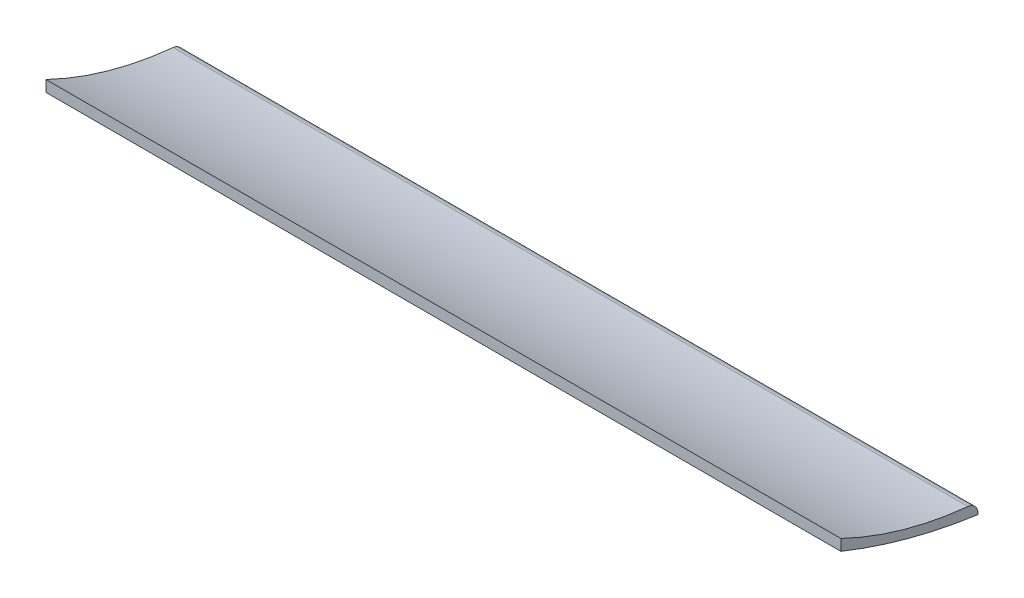
ISO-10303-21;
HEADER;
FILE_DESCRIPTION(('STEP AP214'),'2;1');
FILE_NAME('part.step','',(''),(''),'','','');
FILE_SCHEMA(('AUTOMOTIVE_DESIGN { 1 0 10303 214 1 1 1 1 }'));
ENDSEC;
DATA;
#1=APPLICATION_CONTEXT('core data for automotive mechanical design processes');
#2=APPLICATION_PROTOCOL_DEFINITION('international standard','automotive_design',2000,#1);
#3=PRODUCT_CONTEXT('',#1,'mechanical');
#4=PRODUCT('Part','Part','',(#3));
#5=PRODUCT_RELATED_PRODUCT_CATEGORY('part','',(#4));
#6=PRODUCT_DEFINITION_FORMATION('','',#4);
#7=PRODUCT_DEFINITION_CONTEXT('part definition',#1,'design');
#8=PRODUCT_DEFINITION('design','',#6,#7);
#9=PRODUCT_DEFINITION_SHAPE('','',#8);
#10=(LENGTH_UNIT() NAMED_UNIT(*) SI_UNIT(.MILLI.,.METRE.));
#11=(NAMED_UNIT(*) PLANE_ANGLE_UNIT() SI_UNIT($,.RADIAN.));
#12=(NAMED_UNIT(*) SI_UNIT($,.STERADIAN.) SOLID_ANGLE_UNIT());
#13=UNCERTAINTY_MEASURE_WITH_UNIT(LENGTH_MEASURE(1.E-05),#10,'distance_accuracy_value','');
#14=(GEOMETRIC_REPRESENTATION_CONTEXT(3) GLOBAL_UNCERTAINTY_ASSIGNED_CONTEXT((#13)) GLOBAL_UNIT_ASSIGNED_CONTEXT((#10,
#11,#12)) REPRESENTATION_CONTEXT('',''));
#15=CARTESIAN_POINT('',(0.,0.,0.));
#16=DIRECTION('',(0.,0.,1.));
#17=DIRECTION('',(1.,0.,0.));
#18=AXIS2_PLACEMENT_3D('',#15,#16,#17);
#19=CARTESIAN_POINT('',(711.2,482.087301194355,-194.914940492368));
#20=DIRECTION('',(-1.,0.,0.));
#21=DIRECTION('',(0.,0.,1.));
#22=AXIS2_PLACEMENT_3D('',#19,#20,#21);
#23=CYLINDRICAL_SURFACE('',#22,520.);
#24=CARTESIAN_POINT('',(0.,482.087301194355,-194.914940492368));
#25=DIRECTION('',(1.,0.,0.));
#26=DIRECTION('',(0.,0.,-1.));
#27=AXIS2_PLACEMENT_3D('',#24,#25,#26);
#28=CIRCLE('',#27,520.);
#29=CARTESIAN_POINT('',(0.,0.,0.));
#30=VERTEX_POINT('',#29);
#31=CARTESIAN_POINT('',(0.,-32.8700187280202,-122.672579938712));
#32=VERTEX_POINT('',#31);
#33=EDGE_CURVE('E97',#30,#32,#28,.T.);
#34=ORIENTED_EDGE('',*,*,#33,.T.);
#35=DIRECTION('',(-1.,0.,0.));
#36=VECTOR('',#35,1.);
#37=CARTESIAN_POINT('',(711.2,-32.8700187280202,-122.672579938712));
#38=LINE('',#37,#36);
#39=CARTESIAN_POINT('',(711.2,-32.8700187280202,-122.672579938712));
#40=VERTEX_POINT('',#39);
#41=EDGE_CURVE('E80',#40,#32,#38,.T.);
#42=ORIENTED_EDGE('',*,*,#41,.F.);
#43=CARTESIAN_POINT('',(711.2,482.087301194355,-194.914940492368));
#44=DIRECTION('',(1.,0.,0.));
#45=DIRECTION('',(0.,0.,-1.));
#46=AXIS2_PLACEMENT_3D('',#43,#44,#45);
#47=CIRCLE('',#46,520.);
#48=CARTESIAN_POINT('',(711.2,0.,0.));
#49=VERTEX_POINT('',#48);
#50=EDGE_CURVE('E85',#49,#40,#47,.T.);
#51=ORIENTED_EDGE('',*,*,#50,.F.);
#52=DIRECTION('',(-1.,0.,0.));
#53=VECTOR('',#52,1.);
#54=CARTESIAN_POINT('',(711.2,0.,0.));
#55=LINE('',#54,#53);
#56=EDGE_CURVE('E104',#49,#30,#55,.T.);
#57=ORIENTED_EDGE('',*,*,#56,.T.);
#58=EDGE_LOOP('',(#34,#42,#51,#57));
#59=FACE_BOUND('',#58,.T.);
#60=ADVANCED_FACE('F33',(#59),#23,.T.);
#61=CARTESIAN_POINT('',(711.2,-32.8700187280202,-122.672579938712));
#62=DIRECTION('',(0.,0.,1.));
#63=DIRECTION('',(1.,0.,0.));
#64=AXIS2_PLACEMENT_3D('',#61,#62,#63);
#65=PLANE('',#64);
#66=DIRECTION('',(0.,1.,0.));
#67=VECTOR('',#66,1.);
#68=CARTESIAN_POINT('',(0.,-32.8700187280202,-122.672579938712));
#69=LINE('',#68,#67);
#70=CARTESIAN_POINT('',(0.,-32.0329378685856,-122.672579938712));
#71=VERTEX_POINT('',#70);
#72=EDGE_CURVE('E112',#32,#71,#69,.T.);
#73=ORIENTED_EDGE('',*,*,#72,.T.);
#74=DIRECTION('',(-1.,0.,0.));
#75=VECTOR('',#74,1.);
#76=CARTESIAN_POINT('',(711.2,-32.0329378685856,-122.672579938712));
#77=LINE('',#76,#75);
#78=CARTESIAN_POINT('',(711.2,-32.0329378685856,-122.672579938712));
#79=VERTEX_POINT('',#78);
#80=EDGE_CURVE('E41',#71,#79,#77,.F.);
#81=ORIENTED_EDGE('',*,*,#80,.T.);
#82=DIRECTION('',(0.,1.,0.));
#83=VECTOR('',#82,1.);
#84=CARTESIAN_POINT('',(711.2,-32.8700187280202,-122.672579938712));
#85=LINE('',#84,#83);
#86=EDGE_CURVE('E76',#40,#79,#85,.T.);
#87=ORIENTED_EDGE('',*,*,#86,.F.);
#88=ORIENTED_EDGE('',*,*,#41,.T.);
#89=EDGE_LOOP('',(#73,#81,#87,#88));
#90=FACE_BOUND('',#89,.T.);
#91=ADVANCED_FACE('F78',(#90),#65,.F.);
#92=CARTESIAN_POINT('',(711.2,316.201206630933,-147.786403494234));
#93=DIRECTION('',(-1.,0.,0.));
#94=DIRECTION('',(0.,0.,1.));
#95=AXIS2_PLACEMENT_3D('',#92,#93,#94);
#96=CYLINDRICAL_SURFACE('',#95,340.);
#97=CARTESIAN_POINT('',(711.2,316.201206630933,-147.786403494234));
#98=DIRECTION('',(-1.,0.,0.));
#99=DIRECTION('',(0.,0.,-1.));
#100=AXIS2_PLACEMENT_3D('',#97,#98,#99);
#101=CIRCLE('',#100,340.);
#102=CARTESIAN_POINT('',(711.2,-22.083390882885,-113.675832040298));
#103=VERTEX_POINT('',#102);
#104=CARTESIAN_POINT('',(711.2,10.,0.));
#105=VERTEX_POINT('',#104);
#106=EDGE_CURVE('E84',#103,#105,#101,.T.);
#107=ORIENTED_EDGE('',*,*,#106,.F.);
#108=DIRECTION('',(-1.,0.,0.));
#109=VECTOR('',#108,1.);
#110=CARTESIAN_POINT('',(711.2,-22.083390882885,-113.675832040298));
#111=LINE('',#110,#109);
#112=CARTESIAN_POINT('',(0.,-22.083390882885,-113.675832040298));
#113=VERTEX_POINT('',#112);
#114=EDGE_CURVE('E98',#103,#113,#111,.T.);
#115=ORIENTED_EDGE('',*,*,#114,.T.);
#116=CARTESIAN_POINT('',(0.,316.201206630933,-147.786403494234));
#117=DIRECTION('',(-1.,0.,0.));
#118=DIRECTION('',(0.,0.,-1.));
#119=AXIS2_PLACEMENT_3D('',#116,#117,#118);
#120=CIRCLE('',#119,340.);
#121=CARTESIAN_POINT('',(0.,10.,0.));
#122=VERTEX_POINT('',#121);
#123=EDGE_CURVE('E110',#113,#122,#120,.T.);
#124=ORIENTED_EDGE('',*,*,#123,.T.);
#125=DIRECTION('',(-1.,0.,0.));
#126=VECTOR('',#125,1.);
#127=CARTESIAN_POINT('',(711.2,10.,0.));
#128=LINE('',#127,#126);
#129=EDGE_CURVE('E99',#105,#122,#128,.T.);
#130=ORIENTED_EDGE('',*,*,#129,.F.);
#131=EDGE_LOOP('',(#107,#115,#124,#130));
#132=FACE_BOUND('',#131,.T.);
#133=ADVANCED_FACE('F120',(#132),#96,.F.);
#134=CARTESIAN_POINT('',(711.2,10.,0.));
#135=DIRECTION('',(0.,0.,-1.));
#136=DIRECTION('',(0.,1.,0.));
#137=AXIS2_PLACEMENT_3D('',#134,#135,#136);
#138=PLANE('',#137);
#139=DIRECTION('',(0.,-1.,0.));
#140=VECTOR('',#139,1.);
#141=CARTESIAN_POINT('',(0.,10.,0.));
#142=LINE('',#141,#140);
#143=EDGE_CURVE('E94',#122,#30,#142,.T.);
#144=ORIENTED_EDGE('',*,*,#143,.T.);
#145=ORIENTED_EDGE('',*,*,#56,.F.);
#146=DIRECTION('',(0.,-1.,0.));
#147=VECTOR('',#146,1.);
#148=CARTESIAN_POINT('',(711.2,10.,0.));
#149=LINE('',#148,#147);
#150=EDGE_CURVE('E90',#105,#49,#149,.T.);
#151=ORIENTED_EDGE('',*,*,#150,.F.);
#152=ORIENTED_EDGE('',*,*,#129,.T.);
#153=EDGE_LOOP('',(#144,#145,#151,#152));
#154=FACE_BOUND('',#153,.T.);
#155=ADVANCED_FACE('F123',(#154),#138,.F.);
#156=CARTESIAN_POINT('',(711.2,482.087301194355,-194.914940492368));
#157=DIRECTION('',(1.,0.,0.));
#158=DIRECTION('',(0.,0.,-1.));
#159=AXIS2_PLACEMENT_3D('',#156,#157,#158);
#160=PLANE('',#159);
#161=ORIENTED_EDGE('',*,*,#86,.T.);
#162=CARTESIAN_POINT('',(711.2,-32.0329378685856,-112.672579938712));
#163=DIRECTION('',(1.,0.,0.));
#164=DIRECTION('',(0.,0.,-1.));
#165=AXIS2_PLACEMENT_3D('',#162,#163,#164);
#166=CIRCLE('',#165,10.);
#167=EDGE_CURVE('E11',#79,#103,#166,.T.);
#168=ORIENTED_EDGE('',*,*,#167,.T.);
#169=ORIENTED_EDGE('',*,*,#106,.T.);
#170=ORIENTED_EDGE('',*,*,#150,.T.);
#171=ORIENTED_EDGE('',*,*,#50,.T.);
#172=EDGE_LOOP('',(#161,#168,#169,#170,#171));
#173=FACE_BOUND('',#172,.T.);
#174=ADVANCED_FACE('F88',(#173),#160,.T.);
#175=CARTESIAN_POINT('',(0.,482.087301194355,-194.914940492368));
#176=DIRECTION('',(1.,0.,0.));
#177=DIRECTION('',(0.,0.,-1.));
#178=AXIS2_PLACEMENT_3D('',#175,#176,#177);
#179=PLANE('',#178);
#180=ORIENTED_EDGE('',*,*,#123,.F.);
#181=CARTESIAN_POINT('',(0.,-32.0329378685856,-112.672579938712));
#182=DIRECTION('',(1.,0.,0.));
#183=DIRECTION('',(0.,0.,-1.));
#184=AXIS2_PLACEMENT_3D('',#181,#182,#183);
#185=CIRCLE('',#184,10.);
#186=EDGE_CURVE('E55',#113,#71,#185,.F.);
#187=ORIENTED_EDGE('',*,*,#186,.T.);
#188=ORIENTED_EDGE('',*,*,#72,.F.);
#189=ORIENTED_EDGE('',*,*,#33,.F.);
#190=ORIENTED_EDGE('',*,*,#143,.F.);
#191=EDGE_LOOP('',(#180,#187,#188,#189,#190));
#192=FACE_BOUND('',#191,.T.);
#193=ADVANCED_FACE('F124',(#192),#179,.F.);
#194=CARTESIAN_POINT('',(711.2,-32.0329378685856,-112.672579938712));
#195=DIRECTION('',(-1.,0.,0.));
#196=DIRECTION('',(0.,0.,1.));
#197=AXIS2_PLACEMENT_3D('',#194,#195,#196);
#198=CYLINDRICAL_SURFACE('',#197,10.);
#199=ORIENTED_EDGE('',*,*,#167,.F.);
#200=ORIENTED_EDGE('',*,*,#80,.F.);
#201=ORIENTED_EDGE('',*,*,#186,.F.);
#202=ORIENTED_EDGE('',*,*,#114,.F.);
#203=EDGE_LOOP('',(#199,#200,#201,#202));
#204=FACE_BOUND('',#203,.T.);
#205=ADVANCED_FACE('F35',(#204),#198,.T.);
#206=CLOSED_SHELL('',(#60,#91,#133,#155,#174,#193,#205));
#207=MANIFOLD_SOLID_BREP('B2',#206);
#208=ADVANCED_BREP_SHAPE_REPRESENTATION('',(#18,#207),#14);
#209=SHAPE_DEFINITION_REPRESENTATION(#9,#208);
ENDSEC;
END-ISO-10303-21;
